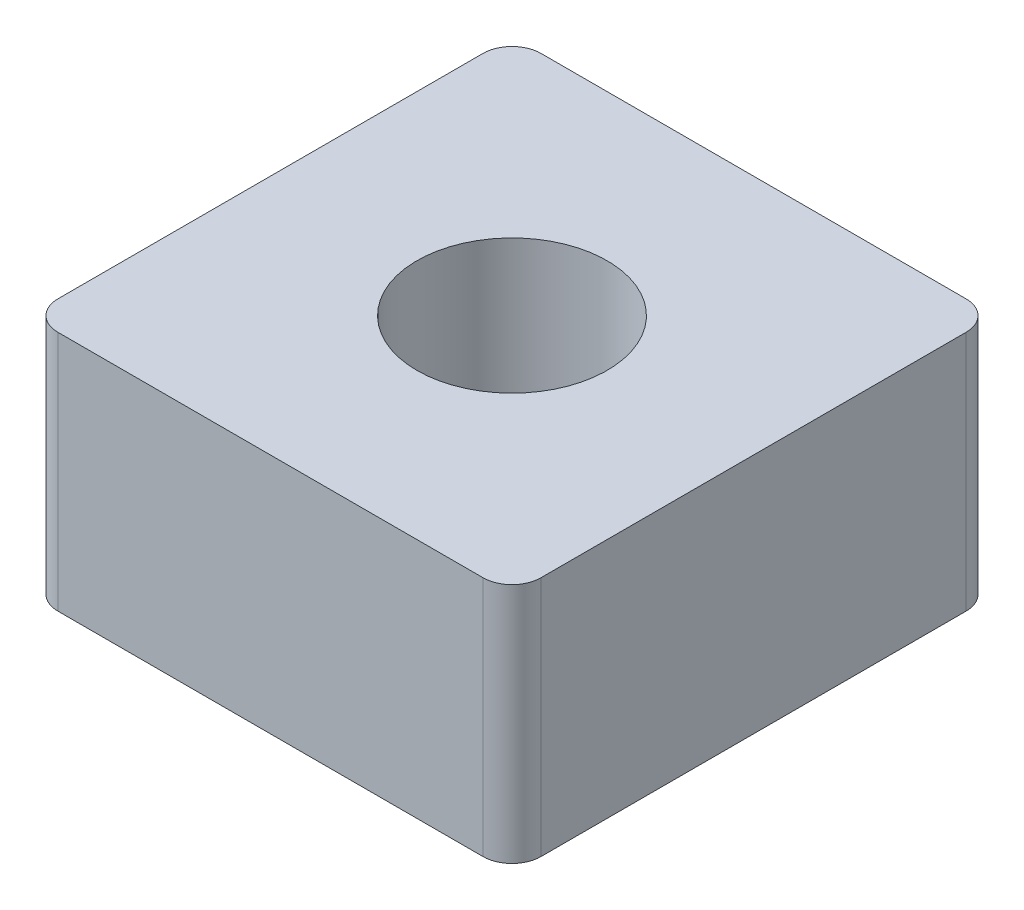
ISO-10303-21;
HEADER;
FILE_DESCRIPTION(('STEP AP214'),'2;1');
FILE_NAME('part.step','',(''),(''),'','','');
FILE_SCHEMA(('AUTOMOTIVE_DESIGN { 1 0 10303 214 1 1 1 1 }'));
ENDSEC;
DATA;
#1=APPLICATION_CONTEXT('core data for automotive mechanical design processes');
#2=APPLICATION_PROTOCOL_DEFINITION('international standard','automotive_design',2000,#1);
#3=PRODUCT_CONTEXT('',#1,'mechanical');
#4=PRODUCT('Part','Part','',(#3));
#5=PRODUCT_RELATED_PRODUCT_CATEGORY('part','',(#4));
#6=PRODUCT_DEFINITION_FORMATION('','',#4);
#7=PRODUCT_DEFINITION_CONTEXT('part definition',#1,'design');
#8=PRODUCT_DEFINITION('design','',#6,#7);
#9=PRODUCT_DEFINITION_SHAPE('','',#8);
#10=(LENGTH_UNIT() NAMED_UNIT(*) SI_UNIT(.MILLI.,.METRE.));
#11=(NAMED_UNIT(*) PLANE_ANGLE_UNIT() SI_UNIT($,.RADIAN.));
#12=(NAMED_UNIT(*) SI_UNIT($,.STERADIAN.) SOLID_ANGLE_UNIT());
#13=UNCERTAINTY_MEASURE_WITH_UNIT(LENGTH_MEASURE(1.E-05),#10,'distance_accuracy_value','');
#14=(GEOMETRIC_REPRESENTATION_CONTEXT(3) GLOBAL_UNCERTAINTY_ASSIGNED_CONTEXT((#13)) GLOBAL_UNIT_ASSIGNED_CONTEXT((#10,
#11,#12)) REPRESENTATION_CONTEXT('',''));
#15=CARTESIAN_POINT('',(0.,0.,0.));
#16=DIRECTION('',(0.,0.,1.));
#17=DIRECTION('',(1.,0.,0.));
#18=AXIS2_PLACEMENT_3D('',#15,#16,#17);
#19=CARTESIAN_POINT('',(-5.588,6.35,5.588));
#20=DIRECTION('',(0.,-1.,0.));
#21=DIRECTION('',(0.,0.,-1.));
#22=AXIS2_PLACEMENT_3D('',#19,#20,#21);
#23=CYLINDRICAL_SURFACE('',#22,0.762);
#24=CARTESIAN_POINT('',(-5.588,0.,5.588));
#25=DIRECTION('',(0.,1.,0.));
#26=DIRECTION('',(0.,0.,-1.));
#27=AXIS2_PLACEMENT_3D('',#24,#25,#26);
#28=CIRCLE('',#27,0.762);
#29=CARTESIAN_POINT('',(-6.35,0.,5.588));
#30=VERTEX_POINT('',#29);
#31=CARTESIAN_POINT('',(-5.58799999999999,0.,6.35));
#32=VERTEX_POINT('',#31);
#33=EDGE_CURVE('E147',#30,#32,#28,.T.);
#34=ORIENTED_EDGE('',*,*,#33,.T.);
#35=DIRECTION('',(0.,-1.,0.));
#36=VECTOR('',#35,1.);
#37=CARTESIAN_POINT('',(-5.58799999999999,6.35,6.35));
#38=LINE('',#37,#36);
#39=CARTESIAN_POINT('',(-5.58799999999999,6.35,6.35));
#40=VERTEX_POINT('',#39);
#41=EDGE_CURVE('E11',#40,#32,#38,.T.);
#42=ORIENTED_EDGE('',*,*,#41,.F.);
#43=CARTESIAN_POINT('',(-5.588,6.35,5.588));
#44=DIRECTION('',(0.,1.,0.));
#45=DIRECTION('',(0.,0.,-1.));
#46=AXIS2_PLACEMENT_3D('',#43,#44,#45);
#47=CIRCLE('',#46,0.762);
#48=CARTESIAN_POINT('',(-6.35,6.35,5.588));
#49=VERTEX_POINT('',#48);
#50=EDGE_CURVE('E162',#49,#40,#47,.T.);
#51=ORIENTED_EDGE('',*,*,#50,.F.);
#52=DIRECTION('',(0.,-1.,0.));
#53=VECTOR('',#52,1.);
#54=CARTESIAN_POINT('',(-6.35,6.35,5.588));
#55=LINE('',#54,#53);
#56=EDGE_CURVE('E143',#49,#30,#55,.T.);
#57=ORIENTED_EDGE('',*,*,#56,.T.);
#58=EDGE_LOOP('',(#34,#42,#51,#57));
#59=FACE_BOUND('',#58,.T.);
#60=ADVANCED_FACE('F51',(#59),#23,.T.);
#61=CARTESIAN_POINT('',(-5.58799999999999,6.35,6.35));
#62=DIRECTION('',(0.,0.,-1.));
#63=DIRECTION('',(-1.,0.,0.));
#64=AXIS2_PLACEMENT_3D('',#61,#62,#63);
#65=PLANE('',#64);
#66=DIRECTION('',(1.,0.,0.));
#67=VECTOR('',#66,1.);
#68=CARTESIAN_POINT('',(-5.58799999999999,0.,6.35));
#69=LINE('',#68,#67);
#70=CARTESIAN_POINT('',(5.58799999999999,0.,6.35));
#71=VERTEX_POINT('',#70);
#72=EDGE_CURVE('E150',#32,#71,#69,.T.);
#73=ORIENTED_EDGE('',*,*,#72,.T.);
#74=DIRECTION('',(0.,-1.,0.));
#75=VECTOR('',#74,1.);
#76=CARTESIAN_POINT('',(5.58799999999999,6.35,6.35));
#77=LINE('',#76,#75);
#78=CARTESIAN_POINT('',(5.58799999999999,6.35,6.35));
#79=VERTEX_POINT('',#78);
#80=EDGE_CURVE('E59',#79,#71,#77,.T.);
#81=ORIENTED_EDGE('',*,*,#80,.F.);
#82=DIRECTION('',(1.,0.,0.));
#83=VECTOR('',#82,1.);
#84=CARTESIAN_POINT('',(-5.58799999999999,6.35,6.35));
#85=LINE('',#84,#83);
#86=EDGE_CURVE('E110',#40,#79,#85,.T.);
#87=ORIENTED_EDGE('',*,*,#86,.F.);
#88=ORIENTED_EDGE('',*,*,#41,.T.);
#89=EDGE_LOOP('',(#73,#81,#87,#88));
#90=FACE_BOUND('',#89,.T.);
#91=ADVANCED_FACE('F216',(#90),#65,.F.);
#92=CARTESIAN_POINT('',(5.588,6.35,5.588));
#93=DIRECTION('',(0.,-1.,0.));
#94=DIRECTION('',(0.,0.,-1.));
#95=AXIS2_PLACEMENT_3D('',#92,#93,#94);
#96=CYLINDRICAL_SURFACE('',#95,0.762);
#97=CARTESIAN_POINT('',(5.588,0.,5.588));
#98=DIRECTION('',(0.,1.,0.));
#99=DIRECTION('',(0.,0.,1.));
#100=AXIS2_PLACEMENT_3D('',#97,#98,#99);
#101=CIRCLE('',#100,0.762);
#102=CARTESIAN_POINT('',(6.35,0.,5.58799999999999));
#103=VERTEX_POINT('',#102);
#104=EDGE_CURVE('E153',#71,#103,#101,.T.);
#105=ORIENTED_EDGE('',*,*,#104,.T.);
#106=DIRECTION('',(0.,-1.,0.));
#107=VECTOR('',#106,1.);
#108=CARTESIAN_POINT('',(6.35,6.35,5.58799999999999));
#109=LINE('',#108,#107);
#110=CARTESIAN_POINT('',(6.35,6.35,5.58799999999999));
#111=VERTEX_POINT('',#110);
#112=EDGE_CURVE('E169',#111,#103,#109,.T.);
#113=ORIENTED_EDGE('',*,*,#112,.F.);
#114=CARTESIAN_POINT('',(5.588,6.35,5.588));
#115=DIRECTION('',(0.,1.,0.));
#116=DIRECTION('',(0.,0.,1.));
#117=AXIS2_PLACEMENT_3D('',#114,#115,#116);
#118=CIRCLE('',#117,0.762);
#119=EDGE_CURVE('E177',#79,#111,#118,.T.);
#120=ORIENTED_EDGE('',*,*,#119,.F.);
#121=ORIENTED_EDGE('',*,*,#80,.T.);
#122=EDGE_LOOP('',(#105,#113,#120,#121));
#123=FACE_BOUND('',#122,.T.);
#124=ADVANCED_FACE('F175',(#123),#96,.T.);
#125=CARTESIAN_POINT('',(6.35,6.35,5.58799999999999));
#126=DIRECTION('',(-1.,0.,0.));
#127=DIRECTION('',(0.,0.,1.));
#128=AXIS2_PLACEMENT_3D('',#125,#126,#127);
#129=PLANE('',#128);
#130=DIRECTION('',(0.,0.,-1.));
#131=VECTOR('',#130,1.);
#132=CARTESIAN_POINT('',(6.35,0.,5.58799999999999));
#133=LINE('',#132,#131);
#134=CARTESIAN_POINT('',(6.35,0.,-5.58799999999999));
#135=VERTEX_POINT('',#134);
#136=EDGE_CURVE('E155',#103,#135,#133,.T.);
#137=ORIENTED_EDGE('',*,*,#136,.T.);
#138=DIRECTION('',(0.,-1.,0.));
#139=VECTOR('',#138,1.);
#140=CARTESIAN_POINT('',(6.35,6.35,-5.58799999999999));
#141=LINE('',#140,#139);
#142=CARTESIAN_POINT('',(6.35,6.35,-5.58799999999999));
#143=VERTEX_POINT('',#142);
#144=EDGE_CURVE('E166',#143,#135,#141,.T.);
#145=ORIENTED_EDGE('',*,*,#144,.F.);
#146=DIRECTION('',(0.,0.,-1.));
#147=VECTOR('',#146,1.);
#148=CARTESIAN_POINT('',(6.35,6.35,5.58799999999999));
#149=LINE('',#148,#147);
#150=EDGE_CURVE('E189',#111,#143,#149,.T.);
#151=ORIENTED_EDGE('',*,*,#150,.F.);
#152=ORIENTED_EDGE('',*,*,#112,.T.);
#153=EDGE_LOOP('',(#137,#145,#151,#152));
#154=FACE_BOUND('',#153,.T.);
#155=ADVANCED_FACE('F185',(#154),#129,.F.);
#156=CARTESIAN_POINT('',(5.588,6.35,-5.588));
#157=DIRECTION('',(0.,-1.,0.));
#158=DIRECTION('',(0.,0.,-1.));
#159=AXIS2_PLACEMENT_3D('',#156,#157,#158);
#160=CYLINDRICAL_SURFACE('',#159,0.762);
#161=CARTESIAN_POINT('',(5.588,0.,-5.588));
#162=DIRECTION('',(0.,1.,0.));
#163=DIRECTION('',(0.,0.,-1.));
#164=AXIS2_PLACEMENT_3D('',#161,#162,#163);
#165=CIRCLE('',#164,0.762);
#166=CARTESIAN_POINT('',(5.58799999999999,0.,-6.35));
#167=VERTEX_POINT('',#166);
#168=EDGE_CURVE('E157',#135,#167,#165,.T.);
#169=ORIENTED_EDGE('',*,*,#168,.T.);
#170=DIRECTION('',(0.,-1.,0.));
#171=VECTOR('',#170,1.);
#172=CARTESIAN_POINT('',(5.58799999999999,6.35,-6.35));
#173=LINE('',#172,#171);
#174=CARTESIAN_POINT('',(5.58799999999999,6.35,-6.35));
#175=VERTEX_POINT('',#174);
#176=EDGE_CURVE('E138',#175,#167,#173,.T.);
#177=ORIENTED_EDGE('',*,*,#176,.F.);
#178=CARTESIAN_POINT('',(5.588,6.35,-5.588));
#179=DIRECTION('',(0.,1.,0.));
#180=DIRECTION('',(0.,0.,-1.));
#181=AXIS2_PLACEMENT_3D('',#178,#179,#180);
#182=CIRCLE('',#181,0.762);
#183=EDGE_CURVE('E129',#143,#175,#182,.T.);
#184=ORIENTED_EDGE('',*,*,#183,.F.);
#185=ORIENTED_EDGE('',*,*,#144,.T.);
#186=EDGE_LOOP('',(#169,#177,#184,#185));
#187=FACE_BOUND('',#186,.T.);
#188=ADVANCED_FACE('F188',(#187),#160,.T.);
#189=CARTESIAN_POINT('',(-5.58799999999999,6.35,-6.35));
#190=DIRECTION('',(0.,0.,1.));
#191=DIRECTION('',(1.,0.,0.));
#192=AXIS2_PLACEMENT_3D('',#189,#190,#191);
#193=PLANE('',#192);
#194=DIRECTION('',(-1.,0.,0.));
#195=VECTOR('',#194,1.);
#196=CARTESIAN_POINT('',(-5.58799999999999,0.,-6.35));
#197=LINE('',#196,#195);
#198=CARTESIAN_POINT('',(-5.58799999999999,0.,-6.35));
#199=VERTEX_POINT('',#198);
#200=EDGE_CURVE('E137',#167,#199,#197,.T.);
#201=ORIENTED_EDGE('',*,*,#200,.T.);
#202=DIRECTION('',(0.,-1.,0.));
#203=VECTOR('',#202,1.);
#204=CARTESIAN_POINT('',(-5.58799999999999,6.35,-6.35));
#205=LINE('',#204,#203);
#206=CARTESIAN_POINT('',(-5.58799999999999,6.35,-6.35));
#207=VERTEX_POINT('',#206);
#208=EDGE_CURVE('E134',#207,#199,#205,.T.);
#209=ORIENTED_EDGE('',*,*,#208,.F.);
#210=DIRECTION('',(-1.,0.,0.));
#211=VECTOR('',#210,1.);
#212=CARTESIAN_POINT('',(-5.58799999999999,6.35,-6.35));
#213=LINE('',#212,#211);
#214=EDGE_CURVE('E123',#175,#207,#213,.T.);
#215=ORIENTED_EDGE('',*,*,#214,.F.);
#216=ORIENTED_EDGE('',*,*,#176,.T.);
#217=EDGE_LOOP('',(#201,#209,#215,#216));
#218=FACE_BOUND('',#217,.T.);
#219=ADVANCED_FACE('F135',(#218),#193,.F.);
#220=CARTESIAN_POINT('',(-5.588,6.35,-5.588));
#221=DIRECTION('',(0.,-1.,0.));
#222=DIRECTION('',(0.,0.,-1.));
#223=AXIS2_PLACEMENT_3D('',#220,#221,#222);
#224=CYLINDRICAL_SURFACE('',#223,0.762);
#225=CARTESIAN_POINT('',(-5.588,0.,-5.588));
#226=DIRECTION('',(0.,1.,0.));
#227=DIRECTION('',(0.,0.,-1.));
#228=AXIS2_PLACEMENT_3D('',#225,#226,#227);
#229=CIRCLE('',#228,0.762);
#230=CARTESIAN_POINT('',(-6.35,0.,-5.58799999999999));
#231=VERTEX_POINT('',#230);
#232=EDGE_CURVE('E96',#199,#231,#229,.T.);
#233=ORIENTED_EDGE('',*,*,#232,.T.);
#234=DIRECTION('',(0.,-1.,0.));
#235=VECTOR('',#234,1.);
#236=CARTESIAN_POINT('',(-6.35,6.35,-5.58799999999999));
#237=LINE('',#236,#235);
#238=CARTESIAN_POINT('',(-6.35,6.35,-5.58799999999999));
#239=VERTEX_POINT('',#238);
#240=EDGE_CURVE('E139',#239,#231,#237,.T.);
#241=ORIENTED_EDGE('',*,*,#240,.F.);
#242=CARTESIAN_POINT('',(-5.588,6.35,-5.588));
#243=DIRECTION('',(0.,1.,0.));
#244=DIRECTION('',(0.,0.,-1.));
#245=AXIS2_PLACEMENT_3D('',#242,#243,#244);
#246=CIRCLE('',#245,0.762);
#247=EDGE_CURVE('E127',#207,#239,#246,.T.);
#248=ORIENTED_EDGE('',*,*,#247,.F.);
#249=ORIENTED_EDGE('',*,*,#208,.T.);
#250=EDGE_LOOP('',(#233,#241,#248,#249));
#251=FACE_BOUND('',#250,.T.);
#252=ADVANCED_FACE('F141',(#251),#224,.T.);
#253=CARTESIAN_POINT('',(-6.35,6.35,5.588));
#254=DIRECTION('',(1.,0.,0.));
#255=DIRECTION('',(0.,0.,-1.));
#256=AXIS2_PLACEMENT_3D('',#253,#254,#255);
#257=PLANE('',#256);
#258=DIRECTION('',(0.,0.,1.));
#259=VECTOR('',#258,1.);
#260=CARTESIAN_POINT('',(-6.35,0.,5.588));
#261=LINE('',#260,#259);
#262=EDGE_CURVE('E102',#231,#30,#261,.T.);
#263=ORIENTED_EDGE('',*,*,#262,.T.);
#264=ORIENTED_EDGE('',*,*,#56,.F.);
#265=DIRECTION('',(0.,0.,1.));
#266=VECTOR('',#265,1.);
#267=CARTESIAN_POINT('',(-6.35,6.35,5.588));
#268=LINE('',#267,#266);
#269=EDGE_CURVE('E67',#239,#49,#268,.T.);
#270=ORIENTED_EDGE('',*,*,#269,.F.);
#271=ORIENTED_EDGE('',*,*,#240,.T.);
#272=EDGE_LOOP('',(#263,#264,#270,#271));
#273=FACE_BOUND('',#272,.T.);
#274=ADVANCED_FACE('F204',(#273),#257,.F.);
#275=CARTESIAN_POINT('',(-5.588,6.35,5.588));
#276=DIRECTION('',(0.,-1.,0.));
#277=DIRECTION('',(0.,0.,-1.));
#278=AXIS2_PLACEMENT_3D('',#275,#276,#277);
#279=PLANE('',#278);
#280=CARTESIAN_POINT('',(0.,6.35,0.));
#281=DIRECTION('',(0.,1.,0.));
#282=DIRECTION('',(0.,0.,1.));
#283=AXIS2_PLACEMENT_3D('',#280,#281,#282);
#284=CIRCLE('',#283,2.5);
#285=CARTESIAN_POINT('',(0.,6.35,2.5));
#286=VERTEX_POINT('',#285);
#287=EDGE_CURVE('E197',#286,#286,#284,.T.);
#288=ORIENTED_EDGE('',*,*,#287,.F.);
#289=EDGE_LOOP('',(#288));
#290=FACE_BOUND('',#289,.T.);
#291=ORIENTED_EDGE('',*,*,#50,.T.);
#292=ORIENTED_EDGE('',*,*,#86,.T.);
#293=ORIENTED_EDGE('',*,*,#119,.T.);
#294=ORIENTED_EDGE('',*,*,#150,.T.);
#295=ORIENTED_EDGE('',*,*,#183,.T.);
#296=ORIENTED_EDGE('',*,*,#214,.T.);
#297=ORIENTED_EDGE('',*,*,#247,.T.);
#298=ORIENTED_EDGE('',*,*,#269,.T.);
#299=EDGE_LOOP('',(#291,#292,#293,#294,#295,#296,#297,#298));
#300=FACE_BOUND('',#299,.T.);
#301=ADVANCED_FACE('F125',(#290,#300),#279,.F.);
#302=CARTESIAN_POINT('',(-5.588,0.,5.588));
#303=DIRECTION('',(0.,-1.,0.));
#304=DIRECTION('',(0.,0.,-1.));
#305=AXIS2_PLACEMENT_3D('',#302,#303,#304);
#306=PLANE('',#305);
#307=CARTESIAN_POINT('',(0.,0.,0.));
#308=DIRECTION('',(0.,1.,0.));
#309=DIRECTION('',(0.,0.,1.));
#310=AXIS2_PLACEMENT_3D('',#307,#308,#309);
#311=CIRCLE('',#310,2.5);
#312=CARTESIAN_POINT('',(0.,0.,2.5));
#313=VERTEX_POINT('',#312);
#314=EDGE_CURVE('E151',#313,#313,#311,.T.);
#315=ORIENTED_EDGE('',*,*,#314,.T.);
#316=EDGE_LOOP('',(#315));
#317=FACE_BOUND('',#316,.T.);
#318=ORIENTED_EDGE('',*,*,#33,.F.);
#319=ORIENTED_EDGE('',*,*,#262,.F.);
#320=ORIENTED_EDGE('',*,*,#232,.F.);
#321=ORIENTED_EDGE('',*,*,#200,.F.);
#322=ORIENTED_EDGE('',*,*,#168,.F.);
#323=ORIENTED_EDGE('',*,*,#136,.F.);
#324=ORIENTED_EDGE('',*,*,#104,.F.);
#325=ORIENTED_EDGE('',*,*,#72,.F.);
#326=EDGE_LOOP('',(#318,#319,#320,#321,#322,#323,#324,#325));
#327=FACE_BOUND('',#326,.T.);
#328=ADVANCED_FACE('F181',(#317,#327),#306,.T.);
#329=CARTESIAN_POINT('',(0.,6.35,0.));
#330=DIRECTION('',(0.,1.,0.));
#331=DIRECTION('',(0.,0.,1.));
#332=AXIS2_PLACEMENT_3D('',#329,#330,#331);
#333=CYLINDRICAL_SURFACE('',#332,2.5);
#334=ORIENTED_EDGE('',*,*,#314,.F.);
#335=EDGE_LOOP('',(#334));
#336=FACE_BOUND('',#335,.T.);
#337=ORIENTED_EDGE('',*,*,#287,.T.);
#338=EDGE_LOOP('',(#337));
#339=FACE_BOUND('',#338,.T.);
#340=ADVANCED_FACE('F201',(#336,#339),#333,.F.);
#341=CLOSED_SHELL('',(#60,#91,#124,#155,#188,#219,#252,#274,#301,#328,#340));
#342=MANIFOLD_SOLID_BREP('B2',#341);
#343=ADVANCED_BREP_SHAPE_REPRESENTATION('',(#18,#342),#14);
#344=SHAPE_DEFINITION_REPRESENTATION(#9,#343);
ENDSEC;
END-ISO-10303-21;
